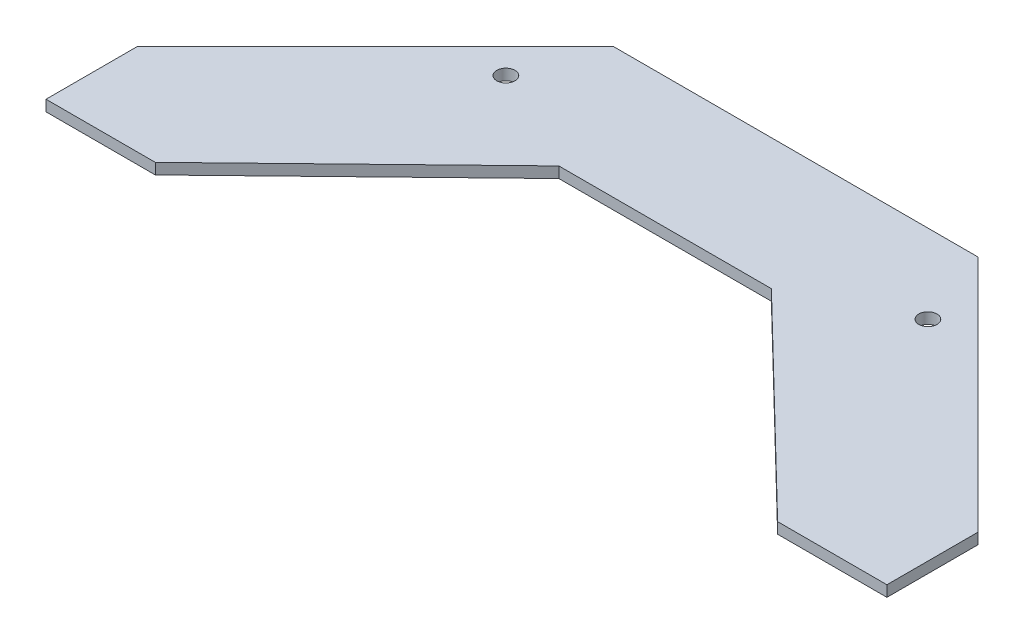
ISO-10303-21;
HEADER;
FILE_DESCRIPTION(('STEP AP214'),'2;1');
FILE_NAME('part.step','',(''),(''),'','','');
FILE_SCHEMA(('AUTOMOTIVE_DESIGN { 1 0 10303 214 1 1 1 1 }'));
ENDSEC;
DATA;
#1=APPLICATION_CONTEXT('core data for automotive mechanical design processes');
#2=APPLICATION_PROTOCOL_DEFINITION('international standard','automotive_design',2000,#1);
#3=PRODUCT_CONTEXT('',#1,'mechanical');
#4=PRODUCT('Part','Part','',(#3));
#5=PRODUCT_RELATED_PRODUCT_CATEGORY('part','',(#4));
#6=PRODUCT_DEFINITION_FORMATION('','',#4);
#7=PRODUCT_DEFINITION_CONTEXT('part definition',#1,'design');
#8=PRODUCT_DEFINITION('design','',#6,#7);
#9=PRODUCT_DEFINITION_SHAPE('','',#8);
#10=(LENGTH_UNIT() NAMED_UNIT(*) SI_UNIT(.MILLI.,.METRE.));
#11=(NAMED_UNIT(*) PLANE_ANGLE_UNIT() SI_UNIT($,.RADIAN.));
#12=(NAMED_UNIT(*) SI_UNIT($,.STERADIAN.) SOLID_ANGLE_UNIT());
#13=UNCERTAINTY_MEASURE_WITH_UNIT(LENGTH_MEASURE(1.E-05),#10,'distance_accuracy_value','');
#14=(GEOMETRIC_REPRESENTATION_CONTEXT(3) GLOBAL_UNCERTAINTY_ASSIGNED_CONTEXT((#13)) GLOBAL_UNIT_ASSIGNED_CONTEXT((#10,
#11,#12)) REPRESENTATION_CONTEXT('',''));
#15=CARTESIAN_POINT('',(0.,0.,0.));
#16=DIRECTION('',(0.,0.,1.));
#17=DIRECTION('',(1.,0.,0.));
#18=AXIS2_PLACEMENT_3D('',#15,#16,#17);
#19=CARTESIAN_POINT('',(-39.2444263558533,1.8,39.2444263558535));
#20=DIRECTION('',(0.707106781186549,0.,0.707106781186546));
#21=DIRECTION('',(0.707106781186546,0.,-0.707106781186549));
#22=AXIS2_PLACEMENT_3D('',#19,#20,#21);
#23=PLANE('',#22);
#24=DIRECTION('',(-0.707106781186546,0.,0.707106781186549));
#25=VECTOR('',#24,1.);
#26=CARTESIAN_POINT('',(-39.2444263558533,0.,39.2444263558535));
#27=LINE('',#26,#25);
#28=CARTESIAN_POINT('',(0.,0.,0.));
#29=VERTEX_POINT('',#28);
#30=CARTESIAN_POINT('',(-39.2444263558533,0.,39.2444263558535));
#31=VERTEX_POINT('',#30);
#32=EDGE_CURVE('E145',#29,#31,#27,.T.);
#33=ORIENTED_EDGE('',*,*,#32,.T.);
#34=DIRECTION('',(0.,-1.,0.));
#35=VECTOR('',#34,1.);
#36=CARTESIAN_POINT('',(-39.2444263558533,1.8,39.2444263558535));
#37=LINE('',#36,#35);
#38=CARTESIAN_POINT('',(-39.2444263558533,1.8,39.2444263558535));
#39=VERTEX_POINT('',#38);
#40=EDGE_CURVE('E11',#39,#31,#37,.T.);
#41=ORIENTED_EDGE('',*,*,#40,.F.);
#42=DIRECTION('',(-0.707106781186546,0.,0.707106781186549));
#43=VECTOR('',#42,1.);
#44=CARTESIAN_POINT('',(-39.2444263558533,1.8,39.2444263558535));
#45=LINE('',#44,#43);
#46=CARTESIAN_POINT('',(0.,1.8,0.));
#47=VERTEX_POINT('',#46);
#48=EDGE_CURVE('E164',#47,#39,#45,.T.);
#49=ORIENTED_EDGE('',*,*,#48,.F.);
#50=DIRECTION('',(0.,-1.,0.));
#51=VECTOR('',#50,1.);
#52=CARTESIAN_POINT('',(0.,1.8,0.));
#53=LINE('',#52,#51);
#54=EDGE_CURVE('E141',#47,#29,#53,.T.);
#55=ORIENTED_EDGE('',*,*,#54,.T.);
#56=EDGE_LOOP('',(#33,#41,#49,#55));
#57=FACE_BOUND('',#56,.T.);
#58=ADVANCED_FACE('F37',(#57),#23,.F.);
#59=CARTESIAN_POINT('',(-39.2444263558533,1.8,54.2444263558535));
#60=DIRECTION('',(1.,0.,0.));
#61=DIRECTION('',(0.,0.,-1.));
#62=AXIS2_PLACEMENT_3D('',#59,#60,#61);
#63=PLANE('',#62);
#64=DIRECTION('',(0.,0.,1.));
#65=VECTOR('',#64,1.);
#66=CARTESIAN_POINT('',(-39.2444263558533,0.,54.2444263558535));
#67=LINE('',#66,#65);
#68=CARTESIAN_POINT('',(-39.2444263558533,0.,54.2444263558535));
#69=VERTEX_POINT('',#68);
#70=EDGE_CURVE('E148',#31,#69,#67,.T.);
#71=ORIENTED_EDGE('',*,*,#70,.T.);
#72=DIRECTION('',(0.,-1.,0.));
#73=VECTOR('',#72,1.);
#74=CARTESIAN_POINT('',(-39.2444263558533,1.8,54.2444263558535));
#75=LINE('',#74,#73);
#76=CARTESIAN_POINT('',(-39.2444263558533,1.8,54.2444263558535));
#77=VERTEX_POINT('',#76);
#78=EDGE_CURVE('E45',#77,#69,#75,.T.);
#79=ORIENTED_EDGE('',*,*,#78,.F.);
#80=DIRECTION('',(0.,0.,1.));
#81=VECTOR('',#80,1.);
#82=CARTESIAN_POINT('',(-39.2444263558533,1.8,54.2444263558535));
#83=LINE('',#82,#81);
#84=EDGE_CURVE('E102',#39,#77,#83,.T.);
#85=ORIENTED_EDGE('',*,*,#84,.F.);
#86=ORIENTED_EDGE('',*,*,#40,.T.);
#87=EDGE_LOOP('',(#71,#79,#85,#86));
#88=FACE_BOUND('',#87,.T.);
#89=ADVANCED_FACE('F247',(#88),#63,.F.);
#90=CARTESIAN_POINT('',(-21.2444263558533,1.8,54.2444263558534));
#91=DIRECTION('',(0.,0.,-1.));
#92=DIRECTION('',(-1.,0.,0.));
#93=AXIS2_PLACEMENT_3D('',#90,#91,#92);
#94=PLANE('',#93);
#95=DIRECTION('',(1.,0.,0.));
#96=VECTOR('',#95,1.);
#97=CARTESIAN_POINT('',(-21.2444263558533,0.,54.2444263558534));
#98=LINE('',#97,#96);
#99=CARTESIAN_POINT('',(-21.2444263558533,0.,54.2444263558534));
#100=VERTEX_POINT('',#99);
#101=EDGE_CURVE('E151',#69,#100,#98,.T.);
#102=ORIENTED_EDGE('',*,*,#101,.T.);
#103=DIRECTION('',(0.,-1.,0.));
#104=VECTOR('',#103,1.);
#105=CARTESIAN_POINT('',(-21.2444263558533,1.8,54.2444263558534));
#106=LINE('',#105,#104);
#107=CARTESIAN_POINT('',(-21.2444263558533,1.8,54.2444263558534));
#108=VERTEX_POINT('',#107);
#109=EDGE_CURVE('E177',#108,#100,#106,.T.);
#110=ORIENTED_EDGE('',*,*,#109,.F.);
#111=DIRECTION('',(1.,0.,0.));
#112=VECTOR('',#111,1.);
#113=CARTESIAN_POINT('',(-21.2444263558533,1.8,54.2444263558534));
#114=LINE('',#113,#112);
#115=EDGE_CURVE('E185',#77,#108,#114,.T.);
#116=ORIENTED_EDGE('',*,*,#115,.F.);
#117=ORIENTED_EDGE('',*,*,#78,.T.);
#118=EDGE_LOOP('',(#102,#110,#116,#117));
#119=FACE_BOUND('',#118,.T.);
#120=ADVANCED_FACE('F183',(#119),#94,.F.);
#121=CARTESIAN_POINT('',(12.5,1.8,21.5287773493857));
#122=DIRECTION('',(-0.696077638435484,0.,-0.717966518209645));
#123=DIRECTION('',(-0.717966518209645,0.,0.696077638435484));
#124=AXIS2_PLACEMENT_3D('',#121,#122,#123);
#125=PLANE('',#124);
#126=DIRECTION('',(0.717966518209645,0.,-0.696077638435484));
#127=VECTOR('',#126,1.);
#128=CARTESIAN_POINT('',(12.5,0.,21.5287773493857));
#129=LINE('',#128,#127);
#130=CARTESIAN_POINT('',(12.5,0.,21.5287773493857));
#131=VERTEX_POINT('',#130);
#132=EDGE_CURVE('E153',#100,#131,#129,.T.);
#133=ORIENTED_EDGE('',*,*,#132,.T.);
#134=DIRECTION('',(0.,-1.,0.));
#135=VECTOR('',#134,1.);
#136=CARTESIAN_POINT('',(12.5,1.8,21.5287773493857));
#137=LINE('',#136,#135);
#138=CARTESIAN_POINT('',(12.5,1.8,21.5287773493857));
#139=VERTEX_POINT('',#138);
#140=EDGE_CURVE('E174',#139,#131,#137,.T.);
#141=ORIENTED_EDGE('',*,*,#140,.F.);
#142=DIRECTION('',(0.717966518209645,0.,-0.696077638435484));
#143=VECTOR('',#142,1.);
#144=CARTESIAN_POINT('',(12.5,1.8,21.5287773493857));
#145=LINE('',#144,#143);
#146=EDGE_CURVE('E203',#108,#139,#145,.T.);
#147=ORIENTED_EDGE('',*,*,#146,.F.);
#148=ORIENTED_EDGE('',*,*,#109,.T.);
#149=EDGE_LOOP('',(#133,#141,#147,#148));
#150=FACE_BOUND('',#149,.T.);
#151=ADVANCED_FACE('F194',(#150),#125,.F.);
#152=CARTESIAN_POINT('',(47.5,1.8,21.5287773493857));
#153=DIRECTION('',(0.,0.,-1.));
#154=DIRECTION('',(-1.,0.,0.));
#155=AXIS2_PLACEMENT_3D('',#152,#153,#154);
#156=PLANE('',#155);
#157=DIRECTION('',(1.,0.,0.));
#158=VECTOR('',#157,1.);
#159=CARTESIAN_POINT('',(47.5,0.,21.5287773493857));
#160=LINE('',#159,#158);
#161=CARTESIAN_POINT('',(47.5,0.,21.5287773493857));
#162=VERTEX_POINT('',#161);
#163=EDGE_CURVE('E155',#131,#162,#160,.T.);
#164=ORIENTED_EDGE('',*,*,#163,.T.);
#165=DIRECTION('',(0.,-1.,0.));
#166=VECTOR('',#165,1.);
#167=CARTESIAN_POINT('',(47.5,1.8,21.5287773493857));
#168=LINE('',#167,#166);
#169=CARTESIAN_POINT('',(47.5,1.8,21.5287773493857));
#170=VERTEX_POINT('',#169);
#171=EDGE_CURVE('E171',#170,#162,#168,.T.);
#172=ORIENTED_EDGE('',*,*,#171,.F.);
#173=DIRECTION('',(1.,0.,0.));
#174=VECTOR('',#173,1.);
#175=CARTESIAN_POINT('',(47.5,1.8,21.5287773493857));
#176=LINE('',#175,#174);
#177=EDGE_CURVE('E200',#139,#170,#176,.T.);
#178=ORIENTED_EDGE('',*,*,#177,.F.);
#179=ORIENTED_EDGE('',*,*,#140,.T.);
#180=EDGE_LOOP('',(#164,#172,#178,#179));
#181=FACE_BOUND('',#180,.T.);
#182=ADVANCED_FACE('F198',(#181),#156,.F.);
#183=CARTESIAN_POINT('',(81.2444263558533,1.8,54.2444263558534));
#184=DIRECTION('',(0.696077638435484,0.,-0.717966518209645));
#185=DIRECTION('',(-0.717966518209645,0.,-0.696077638435484));
#186=AXIS2_PLACEMENT_3D('',#183,#184,#185);
#187=PLANE('',#186);
#188=DIRECTION('',(0.717966518209645,0.,0.696077638435484));
#189=VECTOR('',#188,1.);
#190=CARTESIAN_POINT('',(81.2444263558533,0.,54.2444263558534));
#191=LINE('',#190,#189);
#192=CARTESIAN_POINT('',(81.2444263558533,0.,54.2444263558534));
#193=VERTEX_POINT('',#192);
#194=EDGE_CURVE('E157',#162,#193,#191,.T.);
#195=ORIENTED_EDGE('',*,*,#194,.T.);
#196=DIRECTION('',(0.,-1.,0.));
#197=VECTOR('',#196,1.);
#198=CARTESIAN_POINT('',(81.2444263558533,1.8,54.2444263558534));
#199=LINE('',#198,#197);
#200=CARTESIAN_POINT('',(81.2444263558533,1.8,54.2444263558534));
#201=VERTEX_POINT('',#200);
#202=EDGE_CURVE('E168',#201,#193,#199,.T.);
#203=ORIENTED_EDGE('',*,*,#202,.F.);
#204=DIRECTION('',(0.717966518209645,0.,0.696077638435484));
#205=VECTOR('',#204,1.);
#206=CARTESIAN_POINT('',(81.2444263558533,1.8,54.2444263558534));
#207=LINE('',#206,#205);
#208=EDGE_CURVE('E202',#170,#201,#207,.T.);
#209=ORIENTED_EDGE('',*,*,#208,.F.);
#210=ORIENTED_EDGE('',*,*,#171,.T.);
#211=EDGE_LOOP('',(#195,#203,#209,#210));
#212=FACE_BOUND('',#211,.T.);
#213=ADVANCED_FACE('F259',(#212),#187,.F.);
#214=CARTESIAN_POINT('',(99.2444263558533,1.8,54.2444263558534));
#215=DIRECTION('',(0.,0.,-1.));
#216=DIRECTION('',(-1.,0.,0.));
#217=AXIS2_PLACEMENT_3D('',#214,#215,#216);
#218=PLANE('',#217);
#219=DIRECTION('',(1.,0.,0.));
#220=VECTOR('',#219,1.);
#221=CARTESIAN_POINT('',(99.2444263558533,0.,54.2444263558534));
#222=LINE('',#221,#220);
#223=CARTESIAN_POINT('',(99.2444263558533,0.,54.2444263558534));
#224=VERTEX_POINT('',#223);
#225=EDGE_CURVE('E159',#193,#224,#222,.T.);
#226=ORIENTED_EDGE('',*,*,#225,.T.);
#227=DIRECTION('',(0.,-1.,0.));
#228=VECTOR('',#227,1.);
#229=CARTESIAN_POINT('',(99.2444263558533,1.8,54.2444263558534));
#230=LINE('',#229,#228);
#231=CARTESIAN_POINT('',(99.2444263558533,1.8,54.2444263558534));
#232=VERTEX_POINT('',#231);
#233=EDGE_CURVE('E136',#232,#224,#230,.T.);
#234=ORIENTED_EDGE('',*,*,#233,.F.);
#235=DIRECTION('',(1.,0.,0.));
#236=VECTOR('',#235,1.);
#237=CARTESIAN_POINT('',(99.2444263558533,1.8,54.2444263558534));
#238=LINE('',#237,#236);
#239=EDGE_CURVE('E127',#201,#232,#238,.T.);
#240=ORIENTED_EDGE('',*,*,#239,.F.);
#241=ORIENTED_EDGE('',*,*,#202,.T.);
#242=EDGE_LOOP('',(#226,#234,#240,#241));
#243=FACE_BOUND('',#242,.T.);
#244=ADVANCED_FACE('F256',(#243),#218,.F.);
#245=CARTESIAN_POINT('',(99.2444263558533,1.8,39.2444263558534));
#246=DIRECTION('',(-1.,0.,0.));
#247=DIRECTION('',(0.,0.,1.));
#248=AXIS2_PLACEMENT_3D('',#245,#246,#247);
#249=PLANE('',#248);
#250=DIRECTION('',(0.,0.,-1.));
#251=VECTOR('',#250,1.);
#252=CARTESIAN_POINT('',(99.2444263558533,0.,39.2444263558534));
#253=LINE('',#252,#251);
#254=CARTESIAN_POINT('',(99.2444263558533,0.,39.2444263558534));
#255=VERTEX_POINT('',#254);
#256=EDGE_CURVE('E135',#224,#255,#253,.T.);
#257=ORIENTED_EDGE('',*,*,#256,.T.);
#258=DIRECTION('',(0.,-1.,0.));
#259=VECTOR('',#258,1.);
#260=CARTESIAN_POINT('',(99.2444263558533,1.8,39.2444263558534));
#261=LINE('',#260,#259);
#262=CARTESIAN_POINT('',(99.2444263558533,1.8,39.2444263558534));
#263=VERTEX_POINT('',#262);
#264=EDGE_CURVE('E132',#263,#255,#261,.T.);
#265=ORIENTED_EDGE('',*,*,#264,.F.);
#266=DIRECTION('',(0.,0.,-1.));
#267=VECTOR('',#266,1.);
#268=CARTESIAN_POINT('',(99.2444263558533,1.8,39.2444263558534));
#269=LINE('',#268,#267);
#270=EDGE_CURVE('E121',#232,#263,#269,.T.);
#271=ORIENTED_EDGE('',*,*,#270,.F.);
#272=ORIENTED_EDGE('',*,*,#233,.T.);
#273=EDGE_LOOP('',(#257,#265,#271,#272));
#274=FACE_BOUND('',#273,.T.);
#275=ADVANCED_FACE('F133',(#274),#249,.F.);
#276=CARTESIAN_POINT('',(60.,1.8,0.));
#277=DIRECTION('',(-0.707106781186549,0.,0.707106781186546));
#278=DIRECTION('',(0.707106781186546,0.,0.707106781186549));
#279=AXIS2_PLACEMENT_3D('',#276,#277,#278);
#280=PLANE('',#279);
#281=DIRECTION('',(-0.707106781186546,0.,-0.707106781186549));
#282=VECTOR('',#281,1.);
#283=CARTESIAN_POINT('',(60.,0.,0.));
#284=LINE('',#283,#282);
#285=CARTESIAN_POINT('',(60.,0.,0.));
#286=VERTEX_POINT('',#285);
#287=EDGE_CURVE('E88',#255,#286,#284,.T.);
#288=ORIENTED_EDGE('',*,*,#287,.T.);
#289=DIRECTION('',(0.,-1.,0.));
#290=VECTOR('',#289,1.);
#291=CARTESIAN_POINT('',(60.,1.8,0.));
#292=LINE('',#291,#290);
#293=CARTESIAN_POINT('',(60.,1.8,0.));
#294=VERTEX_POINT('',#293);
#295=EDGE_CURVE('E137',#294,#286,#292,.T.);
#296=ORIENTED_EDGE('',*,*,#295,.F.);
#297=DIRECTION('',(-0.707106781186546,0.,-0.707106781186549));
#298=VECTOR('',#297,1.);
#299=CARTESIAN_POINT('',(60.,1.8,0.));
#300=LINE('',#299,#298);
#301=EDGE_CURVE('E125',#263,#294,#300,.T.);
#302=ORIENTED_EDGE('',*,*,#301,.F.);
#303=ORIENTED_EDGE('',*,*,#264,.T.);
#304=EDGE_LOOP('',(#288,#296,#302,#303));
#305=FACE_BOUND('',#304,.T.);
#306=ADVANCED_FACE('F139',(#305),#280,.F.);
#307=CARTESIAN_POINT('',(0.,1.8,0.));
#308=DIRECTION('',(0.,0.,1.));
#309=DIRECTION('',(1.,0.,0.));
#310=AXIS2_PLACEMENT_3D('',#307,#308,#309);
#311=PLANE('',#310);
#312=DIRECTION('',(-1.,0.,0.));
#313=VECTOR('',#312,1.);
#314=CARTESIAN_POINT('',(0.,0.,0.));
#315=LINE('',#314,#313);
#316=EDGE_CURVE('E94',#286,#29,#315,.T.);
#317=ORIENTED_EDGE('',*,*,#316,.T.);
#318=ORIENTED_EDGE('',*,*,#54,.F.);
#319=DIRECTION('',(-1.,0.,0.));
#320=VECTOR('',#319,1.);
#321=CARTESIAN_POINT('',(0.,1.8,0.));
#322=LINE('',#321,#320);
#323=EDGE_CURVE('E53',#294,#47,#322,.T.);
#324=ORIENTED_EDGE('',*,*,#323,.F.);
#325=ORIENTED_EDGE('',*,*,#295,.T.);
#326=EDGE_LOOP('',(#317,#318,#324,#325));
#327=FACE_BOUND('',#326,.T.);
#328=ADVANCED_FACE('F234',(#327),#311,.F.);
#329=CARTESIAN_POINT('',(0.,1.8,0.));
#330=DIRECTION('',(0.,-1.,0.));
#331=DIRECTION('',(0.,0.,-1.));
#332=AXIS2_PLACEMENT_3D('',#329,#330,#331);
#333=PLANE('',#332);
#334=CARTESIAN_POINT('',(-4.75,1.8,13.));
#335=DIRECTION('',(0.,1.,0.));
#336=DIRECTION('',(0.,0.,1.));
#337=AXIS2_PLACEMENT_3D('',#334,#335,#336);
#338=CIRCLE('',#337,1.5);
#339=CARTESIAN_POINT('',(-4.75,1.8,14.5));
#340=VERTEX_POINT('',#339);
#341=EDGE_CURVE('E217',#340,#340,#338,.T.);
#342=ORIENTED_EDGE('',*,*,#341,.F.);
#343=EDGE_LOOP('',(#342));
#344=FACE_BOUND('',#343,.T.);
#345=CARTESIAN_POINT('',(64.75,1.8,13.));
#346=DIRECTION('',(0.,1.,0.));
#347=DIRECTION('',(0.,0.,1.));
#348=AXIS2_PLACEMENT_3D('',#345,#346,#347);
#349=CIRCLE('',#348,1.5);
#350=CARTESIAN_POINT('',(64.75,1.8,14.5));
#351=VERTEX_POINT('',#350);
#352=EDGE_CURVE('E211',#351,#351,#349,.T.);
#353=ORIENTED_EDGE('',*,*,#352,.F.);
#354=EDGE_LOOP('',(#353));
#355=FACE_BOUND('',#354,.T.);
#356=ORIENTED_EDGE('',*,*,#48,.T.);
#357=ORIENTED_EDGE('',*,*,#84,.T.);
#358=ORIENTED_EDGE('',*,*,#115,.T.);
#359=ORIENTED_EDGE('',*,*,#146,.T.);
#360=ORIENTED_EDGE('',*,*,#177,.T.);
#361=ORIENTED_EDGE('',*,*,#208,.T.);
#362=ORIENTED_EDGE('',*,*,#239,.T.);
#363=ORIENTED_EDGE('',*,*,#270,.T.);
#364=ORIENTED_EDGE('',*,*,#301,.T.);
#365=ORIENTED_EDGE('',*,*,#323,.T.);
#366=EDGE_LOOP('',(#356,#357,#358,#359,#360,#361,#362,#363,#364,#365));
#367=FACE_BOUND('',#366,.T.);
#368=ADVANCED_FACE('F123',(#344,#355,#367),#333,.F.);
#369=CARTESIAN_POINT('',(0.,0.,0.));
#370=DIRECTION('',(0.,-1.,0.));
#371=DIRECTION('',(0.,0.,-1.));
#372=AXIS2_PLACEMENT_3D('',#369,#370,#371);
#373=PLANE('',#372);
#374=CARTESIAN_POINT('',(-4.75,0.,13.));
#375=DIRECTION('',(0.,1.,0.));
#376=DIRECTION('',(0.,0.,1.));
#377=AXIS2_PLACEMENT_3D('',#374,#375,#376);
#378=CIRCLE('',#377,1.5);
#379=CARTESIAN_POINT('',(-4.75,0.,14.5));
#380=VERTEX_POINT('',#379);
#381=EDGE_CURVE('E149',#380,#380,#378,.T.);
#382=ORIENTED_EDGE('',*,*,#381,.T.);
#383=EDGE_LOOP('',(#382));
#384=FACE_BOUND('',#383,.T.);
#385=CARTESIAN_POINT('',(64.75,0.,13.));
#386=DIRECTION('',(0.,1.,0.));
#387=DIRECTION('',(0.,0.,1.));
#388=AXIS2_PLACEMENT_3D('',#385,#386,#387);
#389=CIRCLE('',#388,1.5);
#390=CARTESIAN_POINT('',(64.75,0.,14.5));
#391=VERTEX_POINT('',#390);
#392=EDGE_CURVE('E214',#391,#391,#389,.T.);
#393=ORIENTED_EDGE('',*,*,#392,.T.);
#394=EDGE_LOOP('',(#393));
#395=FACE_BOUND('',#394,.T.);
#396=ORIENTED_EDGE('',*,*,#32,.F.);
#397=ORIENTED_EDGE('',*,*,#316,.F.);
#398=ORIENTED_EDGE('',*,*,#287,.F.);
#399=ORIENTED_EDGE('',*,*,#256,.F.);
#400=ORIENTED_EDGE('',*,*,#225,.F.);
#401=ORIENTED_EDGE('',*,*,#194,.F.);
#402=ORIENTED_EDGE('',*,*,#163,.F.);
#403=ORIENTED_EDGE('',*,*,#132,.F.);
#404=ORIENTED_EDGE('',*,*,#101,.F.);
#405=ORIENTED_EDGE('',*,*,#70,.F.);
#406=EDGE_LOOP('',(#396,#397,#398,#399,#400,#401,#402,#403,#404,#405));
#407=FACE_BOUND('',#406,.T.);
#408=ADVANCED_FACE('F189',(#384,#395,#407),#373,.T.);
#409=CARTESIAN_POINT('',(64.75,0.,13.));
#410=DIRECTION('',(0.,1.,0.));
#411=DIRECTION('',(0.,0.,1.));
#412=AXIS2_PLACEMENT_3D('',#409,#410,#411);
#413=CYLINDRICAL_SURFACE('',#412,1.5);
#414=ORIENTED_EDGE('',*,*,#392,.F.);
#415=EDGE_LOOP('',(#414));
#416=FACE_BOUND('',#415,.T.);
#417=ORIENTED_EDGE('',*,*,#352,.T.);
#418=EDGE_LOOP('',(#417));
#419=FACE_BOUND('',#418,.T.);
#420=ADVANCED_FACE('F228',(#416,#419),#413,.F.);
#421=CARTESIAN_POINT('',(-4.75,0.,13.));
#422=DIRECTION('',(0.,1.,0.));
#423=DIRECTION('',(0.,0.,1.));
#424=AXIS2_PLACEMENT_3D('',#421,#422,#423);
#425=CYLINDRICAL_SURFACE('',#424,1.5);
#426=ORIENTED_EDGE('',*,*,#381,.F.);
#427=EDGE_LOOP('',(#426));
#428=FACE_BOUND('',#427,.T.);
#429=ORIENTED_EDGE('',*,*,#341,.T.);
#430=EDGE_LOOP('',(#429));
#431=FACE_BOUND('',#430,.T.);
#432=ADVANCED_FACE('F225',(#428,#431),#425,.F.);
#433=CLOSED_SHELL('',(#58,#89,#120,#151,#182,#213,#244,#275,#306,#328,#368,#408,#420,#432));
#434=MANIFOLD_SOLID_BREP('B2',#433);
#435=ADVANCED_BREP_SHAPE_REPRESENTATION('',(#18,#434),#14);
#436=SHAPE_DEFINITION_REPRESENTATION(#9,#435);
ENDSEC;
END-ISO-10303-21;
